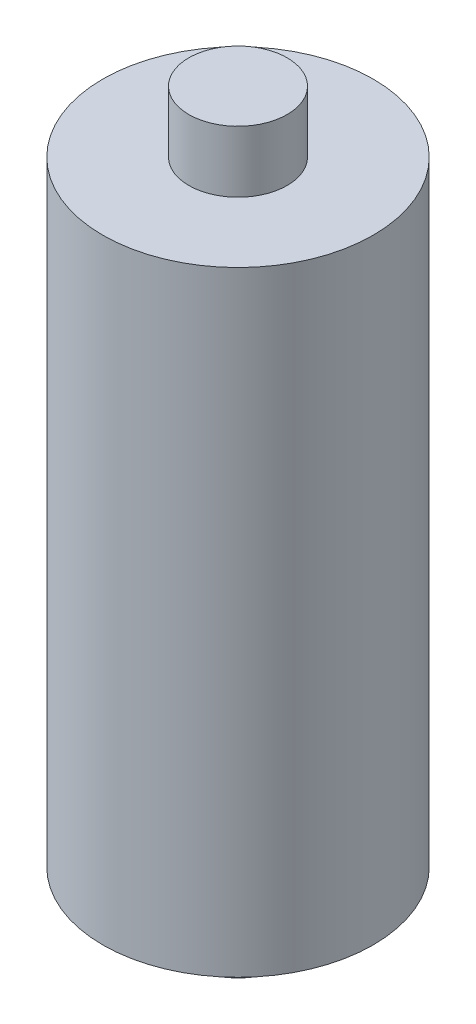
ISO-10303-21;
HEADER;
FILE_DESCRIPTION(('STEP AP214'),'2;1');
FILE_NAME('part.step','',(''),(''),'','','');
FILE_SCHEMA(('AUTOMOTIVE_DESIGN { 1 0 10303 214 1 1 1 1 }'));
ENDSEC;
DATA;
#1=APPLICATION_CONTEXT('core data for automotive mechanical design processes');
#2=APPLICATION_PROTOCOL_DEFINITION('international standard','automotive_design',2000,#1);
#3=PRODUCT_CONTEXT('',#1,'mechanical');
#4=PRODUCT('Part','Part','',(#3));
#5=PRODUCT_RELATED_PRODUCT_CATEGORY('part','',(#4));
#6=PRODUCT_DEFINITION_FORMATION('','',#4);
#7=PRODUCT_DEFINITION_CONTEXT('part definition',#1,'design');
#8=PRODUCT_DEFINITION('design','',#6,#7);
#9=PRODUCT_DEFINITION_SHAPE('','',#8);
#10=(LENGTH_UNIT() NAMED_UNIT(*) SI_UNIT(.MILLI.,.METRE.));
#11=(NAMED_UNIT(*) PLANE_ANGLE_UNIT() SI_UNIT($,.RADIAN.));
#12=(NAMED_UNIT(*) SI_UNIT($,.STERADIAN.) SOLID_ANGLE_UNIT());
#13=UNCERTAINTY_MEASURE_WITH_UNIT(LENGTH_MEASURE(1.E-05),#10,'distance_accuracy_value','');
#14=(GEOMETRIC_REPRESENTATION_CONTEXT(3) GLOBAL_UNCERTAINTY_ASSIGNED_CONTEXT((#13)) GLOBAL_UNIT_ASSIGNED_CONTEXT((#10,
#11,#12)) REPRESENTATION_CONTEXT('',''));
#15=CARTESIAN_POINT('',(0.,0.,0.));
#16=DIRECTION('',(0.,0.,1.));
#17=DIRECTION('',(1.,0.,0.));
#18=AXIS2_PLACEMENT_3D('',#15,#16,#17);
#19=CARTESIAN_POINT('',(0.,25.,0.));
#20=DIRECTION('',(0.,-1.,0.));
#21=DIRECTION('',(0.,0.,-1.));
#22=AXIS2_PLACEMENT_3D('',#19,#20,#21);
#23=CYLINDRICAL_SURFACE('',#22,11.);
#24=CARTESIAN_POINT('',(0.,25.,0.));
#25=DIRECTION('',(0.,1.,0.));
#26=DIRECTION('',(0.,0.,1.));
#27=AXIS2_PLACEMENT_3D('',#24,#25,#26);
#28=CIRCLE('',#27,11.);
#29=CARTESIAN_POINT('',(0.,25.,11.));
#30=VERTEX_POINT('',#29);
#31=EDGE_CURVE('E10',#30,#30,#28,.T.);
#32=ORIENTED_EDGE('',*,*,#31,.F.);
#33=EDGE_LOOP('',(#32));
#34=FACE_BOUND('',#33,.T.);
#35=CARTESIAN_POINT('',(0.,-25.,0.));
#36=DIRECTION('',(0.,1.,0.));
#37=DIRECTION('',(0.,0.,1.));
#38=AXIS2_PLACEMENT_3D('',#35,#36,#37);
#39=CIRCLE('',#38,11.);
#40=CARTESIAN_POINT('',(0.,-25.,11.));
#41=VERTEX_POINT('',#40);
#42=EDGE_CURVE('E36',#41,#41,#39,.T.);
#43=ORIENTED_EDGE('',*,*,#42,.T.);
#44=EDGE_LOOP('',(#43));
#45=FACE_BOUND('',#44,.T.);
#46=ADVANCED_FACE('F33',(#34,#45),#23,.T.);
#47=CARTESIAN_POINT('',(0.,25.,0.));
#48=DIRECTION('',(0.,1.,0.));
#49=DIRECTION('',(0.,0.,1.));
#50=AXIS2_PLACEMENT_3D('',#47,#48,#49);
#51=PLANE('',#50);
#52=CARTESIAN_POINT('',(0.,25.,0.));
#53=DIRECTION('',(0.,1.,0.));
#54=DIRECTION('',(0.,0.,1.));
#55=AXIS2_PLACEMENT_3D('',#52,#53,#54);
#56=CIRCLE('',#55,4.);
#57=CARTESIAN_POINT('',(0.,25.,4.));
#58=VERTEX_POINT('',#57);
#59=EDGE_CURVE('E45',#58,#58,#56,.T.);
#60=ORIENTED_EDGE('',*,*,#59,.F.);
#61=EDGE_LOOP('',(#60));
#62=FACE_BOUND('',#61,.T.);
#63=ORIENTED_EDGE('',*,*,#31,.T.);
#64=EDGE_LOOP('',(#63));
#65=FACE_BOUND('',#64,.T.);
#66=ADVANCED_FACE('F69',(#62,#65),#51,.T.);
#67=CARTESIAN_POINT('',(0.,-25.,0.));
#68=DIRECTION('',(0.,1.,0.));
#69=DIRECTION('',(0.,0.,1.));
#70=AXIS2_PLACEMENT_3D('',#67,#68,#69);
#71=PLANE('',#70);
#72=CARTESIAN_POINT('',(0.,-25.,0.));
#73=DIRECTION('',(0.,1.,0.));
#74=DIRECTION('',(0.,0.,1.));
#75=AXIS2_PLACEMENT_3D('',#72,#73,#74);
#76=CIRCLE('',#75,4.);
#77=CARTESIAN_POINT('',(0.,-25.,4.));
#78=VERTEX_POINT('',#77);
#79=EDGE_CURVE('E51',#78,#78,#76,.T.);
#80=ORIENTED_EDGE('',*,*,#79,.T.);
#81=EDGE_LOOP('',(#80));
#82=FACE_BOUND('',#81,.T.);
#83=ORIENTED_EDGE('',*,*,#42,.F.);
#84=EDGE_LOOP('',(#83));
#85=FACE_BOUND('',#84,.T.);
#86=ADVANCED_FACE('F74',(#82,#85),#71,.F.);
#87=CARTESIAN_POINT('',(0.,30.,0.));
#88=DIRECTION('',(0.,-1.,0.));
#89=DIRECTION('',(0.,0.,-1.));
#90=AXIS2_PLACEMENT_3D('',#87,#88,#89);
#91=CYLINDRICAL_SURFACE('',#90,4.);
#92=CARTESIAN_POINT('',(0.,30.,0.));
#93=DIRECTION('',(0.,1.,0.));
#94=DIRECTION('',(0.,0.,1.));
#95=AXIS2_PLACEMENT_3D('',#92,#93,#94);
#96=CIRCLE('',#95,4.);
#97=CARTESIAN_POINT('',(0.,30.,4.));
#98=VERTEX_POINT('',#97);
#99=EDGE_CURVE('E43',#98,#98,#96,.T.);
#100=ORIENTED_EDGE('',*,*,#99,.F.);
#101=EDGE_LOOP('',(#100));
#102=FACE_BOUND('',#101,.T.);
#103=ORIENTED_EDGE('',*,*,#59,.T.);
#104=EDGE_LOOP('',(#103));
#105=FACE_BOUND('',#104,.T.);
#106=ADVANCED_FACE('F81',(#102,#105),#91,.T.);
#107=CARTESIAN_POINT('',(0.,30.,0.));
#108=DIRECTION('',(0.,1.,0.));
#109=DIRECTION('',(0.,0.,1.));
#110=AXIS2_PLACEMENT_3D('',#107,#108,#109);
#111=PLANE('',#110);
#112=ORIENTED_EDGE('',*,*,#99,.T.);
#113=EDGE_LOOP('',(#112));
#114=FACE_BOUND('',#113,.T.);
#115=ADVANCED_FACE('F66',(#114),#111,.T.);
#116=CARTESIAN_POINT('',(0.,-30.,0.));
#117=DIRECTION('',(0.,1.,0.));
#118=DIRECTION('',(0.,0.,1.));
#119=AXIS2_PLACEMENT_3D('',#116,#117,#118);
#120=CYLINDRICAL_SURFACE('',#119,4.);
#121=CARTESIAN_POINT('',(0.,-30.,0.));
#122=DIRECTION('',(0.,1.,0.));
#123=DIRECTION('',(0.,0.,1.));
#124=AXIS2_PLACEMENT_3D('',#121,#122,#123);
#125=CIRCLE('',#124,4.);
#126=CARTESIAN_POINT('',(0.,-30.,4.));
#127=VERTEX_POINT('',#126);
#128=EDGE_CURVE('E48',#127,#127,#125,.T.);
#129=ORIENTED_EDGE('',*,*,#128,.T.);
#130=EDGE_LOOP('',(#129));
#131=FACE_BOUND('',#130,.T.);
#132=ORIENTED_EDGE('',*,*,#79,.F.);
#133=EDGE_LOOP('',(#132));
#134=FACE_BOUND('',#133,.T.);
#135=ADVANCED_FACE('F57',(#131,#134),#120,.T.);
#136=CARTESIAN_POINT('',(0.,-30.,0.));
#137=DIRECTION('',(0.,-1.,0.));
#138=DIRECTION('',(0.,0.,1.));
#139=AXIS2_PLACEMENT_3D('',#136,#137,#138);
#140=PLANE('',#139);
#141=ORIENTED_EDGE('',*,*,#128,.F.);
#142=EDGE_LOOP('',(#141));
#143=FACE_BOUND('',#142,.T.);
#144=ADVANCED_FACE('F60',(#143),#140,.T.);
#145=CLOSED_SHELL('',(#46,#66,#86,#106,#115,#135,#144));
#146=MANIFOLD_SOLID_BREP('B2',#145);
#147=ADVANCED_BREP_SHAPE_REPRESENTATION('',(#18,#146),#14);
#148=SHAPE_DEFINITION_REPRESENTATION(#9,#147);
ENDSEC;
END-ISO-10303-21;
